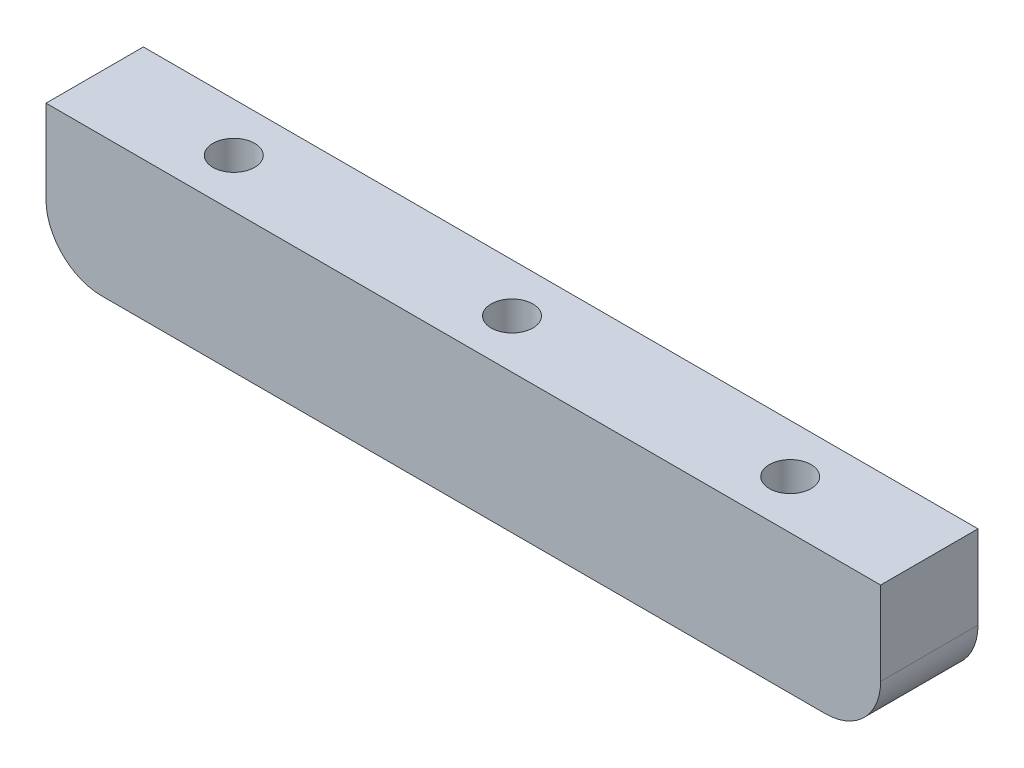
ISO-10303-21;
HEADER;
FILE_DESCRIPTION(('STEP AP214'),'2;1');
FILE_NAME('part.step','',(''),(''),'','','');
FILE_SCHEMA(('AUTOMOTIVE_DESIGN { 1 0 10303 214 1 1 1 1 }'));
ENDSEC;
DATA;
#1=APPLICATION_CONTEXT('core data for automotive mechanical design processes');
#2=APPLICATION_PROTOCOL_DEFINITION('international standard','automotive_design',2000,#1);
#3=PRODUCT_CONTEXT('',#1,'mechanical');
#4=PRODUCT('Part','Part','',(#3));
#5=PRODUCT_RELATED_PRODUCT_CATEGORY('part','',(#4));
#6=PRODUCT_DEFINITION_FORMATION('','',#4);
#7=PRODUCT_DEFINITION_CONTEXT('part definition',#1,'design');
#8=PRODUCT_DEFINITION('design','',#6,#7);
#9=PRODUCT_DEFINITION_SHAPE('','',#8);
#10=(LENGTH_UNIT() NAMED_UNIT(*) SI_UNIT(.MILLI.,.METRE.));
#11=(NAMED_UNIT(*) PLANE_ANGLE_UNIT() SI_UNIT($,.RADIAN.));
#12=(NAMED_UNIT(*) SI_UNIT($,.STERADIAN.) SOLID_ANGLE_UNIT());
#13=UNCERTAINTY_MEASURE_WITH_UNIT(LENGTH_MEASURE(1.E-05),#10,'distance_accuracy_value','');
#14=(GEOMETRIC_REPRESENTATION_CONTEXT(3) GLOBAL_UNCERTAINTY_ASSIGNED_CONTEXT((#13)) GLOBAL_UNIT_ASSIGNED_CONTEXT((#10,
#11,#12)) REPRESENTATION_CONTEXT('',''));
#15=CARTESIAN_POINT('',(0.,0.,0.));
#16=DIRECTION('',(0.,0.,1.));
#17=DIRECTION('',(1.,0.,0.));
#18=AXIS2_PLACEMENT_3D('',#15,#16,#17);
#19=CARTESIAN_POINT('',(30.,10.,-3.5));
#20=DIRECTION('',(-1.,0.,0.));
#21=DIRECTION('',(0.,0.,1.));
#22=AXIS2_PLACEMENT_3D('',#19,#20,#21);
#23=PLANE('',#22);
#24=DIRECTION('',(0.,-1.,0.));
#25=VECTOR('',#24,1.);
#26=CARTESIAN_POINT('',(30.,10.,3.5));
#27=LINE('',#26,#25);
#28=CARTESIAN_POINT('',(30.,10.,3.5));
#29=VERTEX_POINT('',#28);
#30=CARTESIAN_POINT('',(30.,4.,3.5));
#31=VERTEX_POINT('',#30);
#32=EDGE_CURVE('E155',#29,#31,#27,.T.);
#33=ORIENTED_EDGE('',*,*,#32,.T.);
#34=DIRECTION('',(0.,0.,-1.));
#35=VECTOR('',#34,1.);
#36=CARTESIAN_POINT('',(30.,4.,-3.5));
#37=LINE('',#36,#35);
#38=CARTESIAN_POINT('',(30.,4.,-3.5));
#39=VERTEX_POINT('',#38);
#40=EDGE_CURVE('E13',#31,#39,#37,.T.);
#41=ORIENTED_EDGE('',*,*,#40,.T.);
#42=DIRECTION('',(0.,-1.,0.));
#43=VECTOR('',#42,1.);
#44=CARTESIAN_POINT('',(30.,10.,-3.5));
#45=LINE('',#44,#43);
#46=CARTESIAN_POINT('',(30.,10.,-3.5));
#47=VERTEX_POINT('',#46);
#48=EDGE_CURVE('E104',#47,#39,#45,.T.);
#49=ORIENTED_EDGE('',*,*,#48,.F.);
#50=DIRECTION('',(0.,0.,-1.));
#51=VECTOR('',#50,1.);
#52=CARTESIAN_POINT('',(30.,10.,-3.5));
#53=LINE('',#52,#51);
#54=EDGE_CURVE('E110',#29,#47,#53,.T.);
#55=ORIENTED_EDGE('',*,*,#54,.F.);
#56=EDGE_LOOP('',(#33,#41,#49,#55));
#57=FACE_BOUND('',#56,.T.);
#58=ADVANCED_FACE('F45',(#57),#23,.F.);
#59=CARTESIAN_POINT('',(-30.,10.,-3.5));
#60=DIRECTION('',(0.,0.,1.));
#61=DIRECTION('',(1.,0.,0.));
#62=AXIS2_PLACEMENT_3D('',#59,#60,#61);
#63=PLANE('',#62);
#64=DIRECTION('',(-1.,0.,0.));
#65=VECTOR('',#64,1.);
#66=CARTESIAN_POINT('',(-30.,0.,-3.5));
#67=LINE('',#66,#65);
#68=CARTESIAN_POINT('',(26.,0.,-3.5));
#69=VERTEX_POINT('',#68);
#70=CARTESIAN_POINT('',(-26.,0.,-3.5));
#71=VERTEX_POINT('',#70);
#72=EDGE_CURVE('E137',#69,#71,#67,.T.);
#73=ORIENTED_EDGE('',*,*,#72,.T.);
#74=CARTESIAN_POINT('',(-26.,4.,-3.5));
#75=DIRECTION('',(0.,0.,1.));
#76=DIRECTION('',(1.,0.,0.));
#77=AXIS2_PLACEMENT_3D('',#74,#75,#76);
#78=CIRCLE('',#77,4.);
#79=CARTESIAN_POINT('',(-30.,4.,-3.5));
#80=VERTEX_POINT('',#79);
#81=EDGE_CURVE('E53',#71,#80,#78,.F.);
#82=ORIENTED_EDGE('',*,*,#81,.T.);
#83=DIRECTION('',(0.,-1.,0.));
#84=VECTOR('',#83,1.);
#85=CARTESIAN_POINT('',(-30.,10.,-3.5));
#86=LINE('',#85,#84);
#87=CARTESIAN_POINT('',(-30.,10.,-3.5));
#88=VERTEX_POINT('',#87);
#89=EDGE_CURVE('E106',#88,#80,#86,.T.);
#90=ORIENTED_EDGE('',*,*,#89,.F.);
#91=DIRECTION('',(-1.,0.,0.));
#92=VECTOR('',#91,1.);
#93=CARTESIAN_POINT('',(-30.,10.,-3.5));
#94=LINE('',#93,#92);
#95=EDGE_CURVE('E100',#47,#88,#94,.T.);
#96=ORIENTED_EDGE('',*,*,#95,.F.);
#97=ORIENTED_EDGE('',*,*,#48,.T.);
#98=CARTESIAN_POINT('',(26.,4.,-3.5));
#99=DIRECTION('',(0.,0.,1.));
#100=DIRECTION('',(1.,0.,0.));
#101=AXIS2_PLACEMENT_3D('',#98,#99,#100);
#102=CIRCLE('',#101,4.);
#103=EDGE_CURVE('E60',#39,#69,#102,.F.);
#104=ORIENTED_EDGE('',*,*,#103,.T.);
#105=EDGE_LOOP('',(#73,#82,#90,#96,#97,#104));
#106=FACE_BOUND('',#105,.T.);
#107=ADVANCED_FACE('F102',(#106),#63,.F.);
#108=CARTESIAN_POINT('',(-30.,10.,-3.5));
#109=DIRECTION('',(1.,0.,0.));
#110=DIRECTION('',(0.,0.,-1.));
#111=AXIS2_PLACEMENT_3D('',#108,#109,#110);
#112=PLANE('',#111);
#113=ORIENTED_EDGE('',*,*,#89,.T.);
#114=DIRECTION('',(0.,0.,1.));
#115=VECTOR('',#114,1.);
#116=CARTESIAN_POINT('',(-30.,4.,-3.5));
#117=LINE('',#116,#115);
#118=CARTESIAN_POINT('',(-30.,4.,3.5));
#119=VERTEX_POINT('',#118);
#120=EDGE_CURVE('E121',#80,#119,#117,.T.);
#121=ORIENTED_EDGE('',*,*,#120,.T.);
#122=DIRECTION('',(0.,-1.,0.));
#123=VECTOR('',#122,1.);
#124=CARTESIAN_POINT('',(-30.,10.,3.5));
#125=LINE('',#124,#123);
#126=CARTESIAN_POINT('',(-30.,10.,3.5));
#127=VERTEX_POINT('',#126);
#128=EDGE_CURVE('E126',#127,#119,#125,.T.);
#129=ORIENTED_EDGE('',*,*,#128,.F.);
#130=DIRECTION('',(0.,0.,1.));
#131=VECTOR('',#130,1.);
#132=CARTESIAN_POINT('',(-30.,10.,-3.5));
#133=LINE('',#132,#131);
#134=EDGE_CURVE('E109',#88,#127,#133,.T.);
#135=ORIENTED_EDGE('',*,*,#134,.F.);
#136=EDGE_LOOP('',(#113,#121,#129,#135));
#137=FACE_BOUND('',#136,.T.);
#138=ADVANCED_FACE('F141',(#137),#112,.F.);
#139=CARTESIAN_POINT('',(-30.,10.,3.5));
#140=DIRECTION('',(0.,0.,-1.));
#141=DIRECTION('',(-1.,0.,0.));
#142=AXIS2_PLACEMENT_3D('',#139,#140,#141);
#143=PLANE('',#142);
#144=ORIENTED_EDGE('',*,*,#128,.T.);
#145=CARTESIAN_POINT('',(-26.,4.,3.5));
#146=DIRECTION('',(0.,0.,-1.));
#147=DIRECTION('',(-1.,0.,0.));
#148=AXIS2_PLACEMENT_3D('',#145,#146,#147);
#149=CIRCLE('',#148,4.);
#150=CARTESIAN_POINT('',(-26.,0.,3.5));
#151=VERTEX_POINT('',#150);
#152=EDGE_CURVE('E131',#119,#151,#149,.F.);
#153=ORIENTED_EDGE('',*,*,#152,.T.);
#154=DIRECTION('',(1.,0.,0.));
#155=VECTOR('',#154,1.);
#156=CARTESIAN_POINT('',(-30.,0.,3.5));
#157=LINE('',#156,#155);
#158=CARTESIAN_POINT('',(26.,0.,3.5));
#159=VERTEX_POINT('',#158);
#160=EDGE_CURVE('E119',#151,#159,#157,.T.);
#161=ORIENTED_EDGE('',*,*,#160,.T.);
#162=CARTESIAN_POINT('',(26.,4.,3.5));
#163=DIRECTION('',(0.,0.,-1.));
#164=DIRECTION('',(-1.,0.,0.));
#165=AXIS2_PLACEMENT_3D('',#162,#163,#164);
#166=CIRCLE('',#165,4.);
#167=EDGE_CURVE('E124',#159,#31,#166,.F.);
#168=ORIENTED_EDGE('',*,*,#167,.T.);
#169=ORIENTED_EDGE('',*,*,#32,.F.);
#170=DIRECTION('',(1.,0.,0.));
#171=VECTOR('',#170,1.);
#172=CARTESIAN_POINT('',(-30.,10.,3.5));
#173=LINE('',#172,#171);
#174=EDGE_CURVE('E115',#127,#29,#173,.T.);
#175=ORIENTED_EDGE('',*,*,#174,.F.);
#176=EDGE_LOOP('',(#144,#153,#161,#168,#169,#175));
#177=FACE_BOUND('',#176,.T.);
#178=ADVANCED_FACE('F147',(#177),#143,.F.);
#179=CARTESIAN_POINT('',(0.,10.,0.));
#180=DIRECTION('',(0.,1.,0.));
#181=DIRECTION('',(0.,0.,1.));
#182=AXIS2_PLACEMENT_3D('',#179,#180,#181);
#183=PLANE('',#182);
#184=CARTESIAN_POINT('',(-20.,10.,0.));
#185=DIRECTION('',(0.,1.,0.));
#186=DIRECTION('',(0.,0.,1.));
#187=AXIS2_PLACEMENT_3D('',#184,#185,#186);
#188=CIRCLE('',#187,1.5);
#189=CARTESIAN_POINT('',(-20.,10.,1.5));
#190=VERTEX_POINT('',#189);
#191=EDGE_CURVE('E164',#190,#190,#188,.T.);
#192=ORIENTED_EDGE('',*,*,#191,.F.);
#193=EDGE_LOOP('',(#192));
#194=FACE_BOUND('',#193,.T.);
#195=CARTESIAN_POINT('',(20.,10.,0.));
#196=DIRECTION('',(0.,1.,0.));
#197=DIRECTION('',(0.,0.,1.));
#198=AXIS2_PLACEMENT_3D('',#195,#196,#197);
#199=CIRCLE('',#198,1.5);
#200=CARTESIAN_POINT('',(20.,10.,1.5));
#201=VERTEX_POINT('',#200);
#202=EDGE_CURVE('E170',#201,#201,#199,.T.);
#203=ORIENTED_EDGE('',*,*,#202,.F.);
#204=EDGE_LOOP('',(#203));
#205=FACE_BOUND('',#204,.T.);
#206=CARTESIAN_POINT('',(0.,10.,0.));
#207=DIRECTION('',(0.,1.,0.));
#208=DIRECTION('',(0.,0.,1.));
#209=AXIS2_PLACEMENT_3D('',#206,#207,#208);
#210=CIRCLE('',#209,1.5);
#211=CARTESIAN_POINT('',(0.,10.,1.5));
#212=VERTEX_POINT('',#211);
#213=EDGE_CURVE('E158',#212,#212,#210,.T.);
#214=ORIENTED_EDGE('',*,*,#213,.F.);
#215=EDGE_LOOP('',(#214));
#216=FACE_BOUND('',#215,.T.);
#217=ORIENTED_EDGE('',*,*,#54,.T.);
#218=ORIENTED_EDGE('',*,*,#95,.T.);
#219=ORIENTED_EDGE('',*,*,#134,.T.);
#220=ORIENTED_EDGE('',*,*,#174,.T.);
#221=EDGE_LOOP('',(#217,#218,#219,#220));
#222=FACE_BOUND('',#221,.T.);
#223=ADVANCED_FACE('F113',(#194,#205,#216,#222),#183,.T.);
#224=CARTESIAN_POINT('',(0.,0.,0.));
#225=DIRECTION('',(0.,1.,0.));
#226=DIRECTION('',(0.,0.,1.));
#227=AXIS2_PLACEMENT_3D('',#224,#225,#226);
#228=PLANE('',#227);
#229=ORIENTED_EDGE('',*,*,#160,.F.);
#230=DIRECTION('',(0.,0.,1.));
#231=VECTOR('',#230,1.);
#232=CARTESIAN_POINT('',(-26.,0.,0.));
#233=LINE('',#232,#231);
#234=EDGE_CURVE('E67',#151,#71,#233,.F.);
#235=ORIENTED_EDGE('',*,*,#234,.T.);
#236=ORIENTED_EDGE('',*,*,#72,.F.);
#237=DIRECTION('',(0.,0.,-1.));
#238=VECTOR('',#237,1.);
#239=CARTESIAN_POINT('',(26.,0.,0.));
#240=LINE('',#239,#238);
#241=EDGE_CURVE('E133',#69,#159,#240,.F.);
#242=ORIENTED_EDGE('',*,*,#241,.T.);
#243=EDGE_LOOP('',(#229,#235,#236,#242));
#244=FACE_BOUND('',#243,.T.);
#245=ADVANCED_FACE('F149',(#244),#228,.F.);
#246=CARTESIAN_POINT('',(0.,5.,0.));
#247=DIRECTION('',(0.,1.,0.));
#248=DIRECTION('',(0.,0.,1.));
#249=AXIS2_PLACEMENT_3D('',#246,#247,#248);
#250=CYLINDRICAL_SURFACE('',#249,1.5);
#251=CARTESIAN_POINT('',(0.,5.,0.));
#252=DIRECTION('',(0.,1.,0.));
#253=DIRECTION('',(0.,0.,1.));
#254=AXIS2_PLACEMENT_3D('',#251,#252,#253);
#255=CIRCLE('',#254,1.5);
#256=CARTESIAN_POINT('',(0.,5.,1.5));
#257=VERTEX_POINT('',#256);
#258=EDGE_CURVE('E151',#257,#257,#255,.T.);
#259=ORIENTED_EDGE('',*,*,#258,.F.);
#260=EDGE_LOOP('',(#259));
#261=FACE_BOUND('',#260,.T.);
#262=ORIENTED_EDGE('',*,*,#213,.T.);
#263=EDGE_LOOP('',(#262));
#264=FACE_BOUND('',#263,.T.);
#265=ADVANCED_FACE('F191',(#261,#264),#250,.F.);
#266=CARTESIAN_POINT('',(0.,5.,0.));
#267=DIRECTION('',(0.,1.,0.));
#268=DIRECTION('',(0.,0.,1.));
#269=AXIS2_PLACEMENT_3D('',#266,#267,#268);
#270=PLANE('',#269);
#271=ORIENTED_EDGE('',*,*,#258,.T.);
#272=EDGE_LOOP('',(#271));
#273=FACE_BOUND('',#272,.T.);
#274=ADVANCED_FACE('F181',(#273),#270,.T.);
#275=CARTESIAN_POINT('',(20.,5.,0.));
#276=DIRECTION('',(0.,1.,0.));
#277=DIRECTION('',(0.,0.,1.));
#278=AXIS2_PLACEMENT_3D('',#275,#276,#277);
#279=CYLINDRICAL_SURFACE('',#278,1.5);
#280=CARTESIAN_POINT('',(20.,5.,0.));
#281=DIRECTION('',(0.,1.,0.));
#282=DIRECTION('',(0.,0.,1.));
#283=AXIS2_PLACEMENT_3D('',#280,#281,#282);
#284=CIRCLE('',#283,1.5);
#285=CARTESIAN_POINT('',(20.,5.,1.5));
#286=VERTEX_POINT('',#285);
#287=EDGE_CURVE('E161',#286,#286,#284,.T.);
#288=ORIENTED_EDGE('',*,*,#287,.F.);
#289=EDGE_LOOP('',(#288));
#290=FACE_BOUND('',#289,.T.);
#291=ORIENTED_EDGE('',*,*,#202,.T.);
#292=EDGE_LOOP('',(#291));
#293=FACE_BOUND('',#292,.T.);
#294=ADVANCED_FACE('F178',(#290,#293),#279,.F.);
#295=CARTESIAN_POINT('',(20.,5.,0.));
#296=DIRECTION('',(0.,1.,0.));
#297=DIRECTION('',(0.,0.,1.));
#298=AXIS2_PLACEMENT_3D('',#295,#296,#297);
#299=PLANE('',#298);
#300=ORIENTED_EDGE('',*,*,#287,.T.);
#301=EDGE_LOOP('',(#300));
#302=FACE_BOUND('',#301,.T.);
#303=ADVANCED_FACE('F176',(#302),#299,.T.);
#304=CARTESIAN_POINT('',(-20.,5.,0.));
#305=DIRECTION('',(0.,1.,0.));
#306=DIRECTION('',(0.,0.,1.));
#307=AXIS2_PLACEMENT_3D('',#304,#305,#306);
#308=CYLINDRICAL_SURFACE('',#307,1.5);
#309=CARTESIAN_POINT('',(-20.,5.,0.));
#310=DIRECTION('',(0.,1.,0.));
#311=DIRECTION('',(0.,0.,1.));
#312=AXIS2_PLACEMENT_3D('',#309,#310,#311);
#313=CIRCLE('',#312,1.5);
#314=CARTESIAN_POINT('',(-20.,5.,1.5));
#315=VERTEX_POINT('',#314);
#316=EDGE_CURVE('E167',#315,#315,#313,.T.);
#317=ORIENTED_EDGE('',*,*,#316,.F.);
#318=EDGE_LOOP('',(#317));
#319=FACE_BOUND('',#318,.T.);
#320=ORIENTED_EDGE('',*,*,#191,.T.);
#321=EDGE_LOOP('',(#320));
#322=FACE_BOUND('',#321,.T.);
#323=ADVANCED_FACE('F216',(#319,#322),#308,.F.);
#324=CARTESIAN_POINT('',(-20.,5.,0.));
#325=DIRECTION('',(0.,1.,0.));
#326=DIRECTION('',(0.,0.,1.));
#327=AXIS2_PLACEMENT_3D('',#324,#325,#326);
#328=PLANE('',#327);
#329=ORIENTED_EDGE('',*,*,#316,.T.);
#330=EDGE_LOOP('',(#329));
#331=FACE_BOUND('',#330,.T.);
#332=ADVANCED_FACE('F211',(#331),#328,.T.);
#333=CARTESIAN_POINT('',(-26.,4.,-3.5));
#334=DIRECTION('',(0.,0.,1.));
#335=DIRECTION('',(1.,0.,0.));
#336=AXIS2_PLACEMENT_3D('',#333,#334,#335);
#337=CYLINDRICAL_SURFACE('',#336,4.);
#338=ORIENTED_EDGE('',*,*,#81,.F.);
#339=ORIENTED_EDGE('',*,*,#234,.F.);
#340=ORIENTED_EDGE('',*,*,#152,.F.);
#341=ORIENTED_EDGE('',*,*,#120,.F.);
#342=EDGE_LOOP('',(#338,#339,#340,#341));
#343=FACE_BOUND('',#342,.T.);
#344=ADVANCED_FACE('F144',(#343),#337,.T.);
#345=CARTESIAN_POINT('',(26.,4.,-3.5));
#346=DIRECTION('',(0.,0.,-1.));
#347=DIRECTION('',(-1.,0.,0.));
#348=AXIS2_PLACEMENT_3D('',#345,#346,#347);
#349=CYLINDRICAL_SURFACE('',#348,4.);
#350=ORIENTED_EDGE('',*,*,#167,.F.);
#351=ORIENTED_EDGE('',*,*,#241,.F.);
#352=ORIENTED_EDGE('',*,*,#103,.F.);
#353=ORIENTED_EDGE('',*,*,#40,.F.);
#354=EDGE_LOOP('',(#350,#351,#352,#353));
#355=FACE_BOUND('',#354,.T.);
#356=ADVANCED_FACE('F47',(#355),#349,.T.);
#357=CLOSED_SHELL('',(#58,#107,#138,#178,#223,#245,#265,#274,#294,#303,#323,#332,#344,#356));
#358=MANIFOLD_SOLID_BREP('B2',#357);
#359=ADVANCED_BREP_SHAPE_REPRESENTATION('',(#18,#358),#14);
#360=SHAPE_DEFINITION_REPRESENTATION(#9,#359);
ENDSEC;
END-ISO-10303-21;
